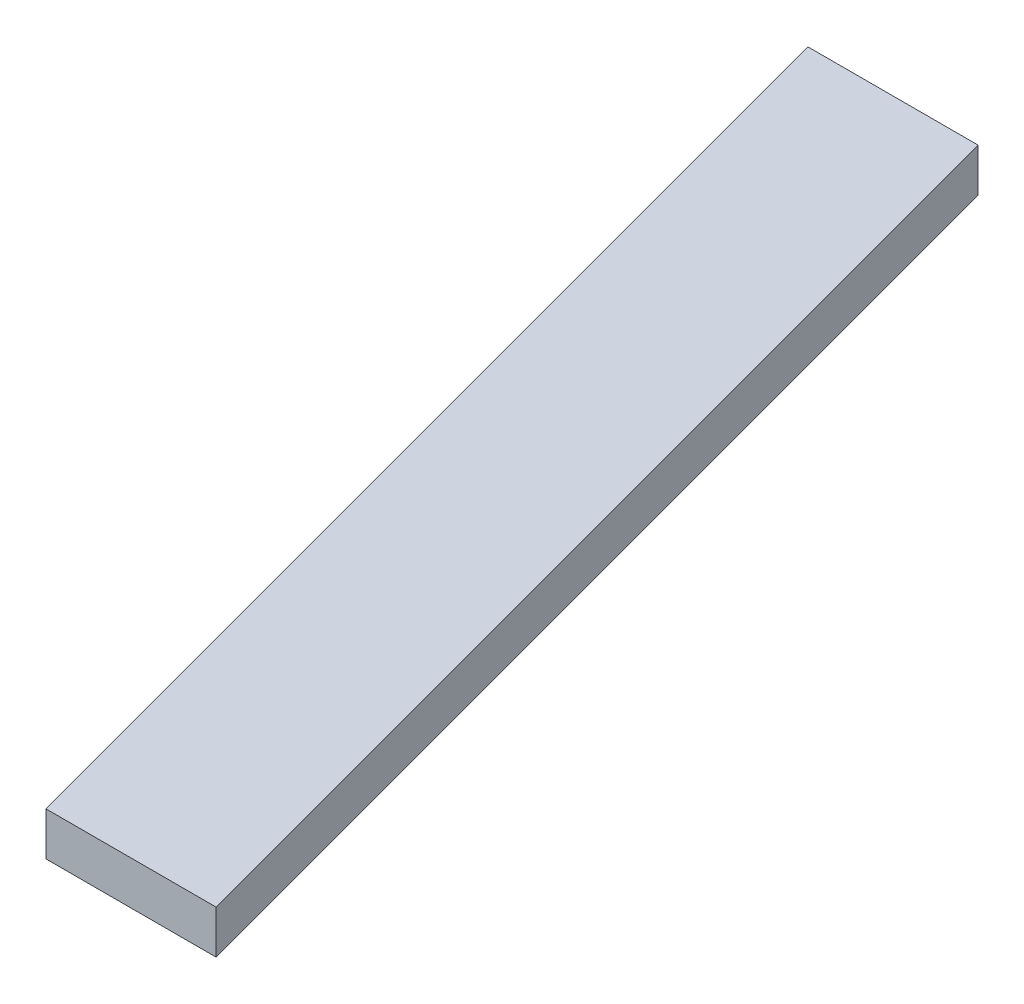
ISO-10303-21;
HEADER;
FILE_DESCRIPTION(('STEP AP214'),'2;1');
FILE_NAME('part.step','',(''),(''),'','','');
FILE_SCHEMA(('AUTOMOTIVE_DESIGN { 1 0 10303 214 1 1 1 1 }'));
ENDSEC;
DATA;
#1=APPLICATION_CONTEXT('core data for automotive mechanical design processes');
#2=APPLICATION_PROTOCOL_DEFINITION('international standard','automotive_design',2000,#1);
#3=PRODUCT_CONTEXT('',#1,'mechanical');
#4=PRODUCT('Part','Part','',(#3));
#5=PRODUCT_RELATED_PRODUCT_CATEGORY('part','',(#4));
#6=PRODUCT_DEFINITION_FORMATION('','',#4);
#7=PRODUCT_DEFINITION_CONTEXT('part definition',#1,'design');
#8=PRODUCT_DEFINITION('design','',#6,#7);
#9=PRODUCT_DEFINITION_SHAPE('','',#8);
#10=(LENGTH_UNIT() NAMED_UNIT(*) SI_UNIT(.MILLI.,.METRE.));
#11=(NAMED_UNIT(*) PLANE_ANGLE_UNIT() SI_UNIT($,.RADIAN.));
#12=(NAMED_UNIT(*) SI_UNIT($,.STERADIAN.) SOLID_ANGLE_UNIT());
#13=UNCERTAINTY_MEASURE_WITH_UNIT(LENGTH_MEASURE(1.E-05),#10,'distance_accuracy_value','');
#14=(GEOMETRIC_REPRESENTATION_CONTEXT(3) GLOBAL_UNCERTAINTY_ASSIGNED_CONTEXT((#13)) GLOBAL_UNIT_ASSIGNED_CONTEXT((#10,
#11,#12)) REPRESENTATION_CONTEXT('',''));
#15=CARTESIAN_POINT('',(0.,0.,0.));
#16=DIRECTION('',(0.,0.,1.));
#17=DIRECTION('',(1.,0.,0.));
#18=AXIS2_PLACEMENT_3D('',#15,#16,#17);
#19=CARTESIAN_POINT('',(20.4177284632519,3.175,76.2));
#20=DIRECTION('',(0.965925826289067,0.,-0.258819045102525));
#21=DIRECTION('',(-0.258819045102525,0.,-0.965925826289067));
#22=AXIS2_PLACEMENT_3D('',#19,#20,#21);
#23=PLANE('',#22);
#24=DIRECTION('',(0.258819045102525,0.,0.965925826289067));
#25=VECTOR('',#24,1.);
#26=CARTESIAN_POINT('',(20.4177284632519,0.,76.2));
#27=LINE('',#26,#25);
#28=CARTESIAN_POINT('',(0.,0.,0.));
#29=VERTEX_POINT('',#28);
#30=CARTESIAN_POINT('',(20.4177284632519,0.,76.2));
#31=VERTEX_POINT('',#30);
#32=EDGE_CURVE('E105',#29,#31,#27,.T.);
#33=ORIENTED_EDGE('',*,*,#32,.T.);
#34=DIRECTION('',(0.,-1.,0.));
#35=VECTOR('',#34,1.);
#36=CARTESIAN_POINT('',(20.4177284632519,3.175,76.2));
#37=LINE('',#36,#35);
#38=CARTESIAN_POINT('',(20.4177284632519,3.175,76.2));
#39=VERTEX_POINT('',#38);
#40=EDGE_CURVE('E11',#39,#31,#37,.T.);
#41=ORIENTED_EDGE('',*,*,#40,.F.);
#42=DIRECTION('',(0.258819045102525,0.,0.965925826289067));
#43=VECTOR('',#42,1.);
#44=CARTESIAN_POINT('',(20.4177284632519,3.175,76.2));
#45=LINE('',#44,#43);
#46=CARTESIAN_POINT('',(0.,3.175,0.));
#47=VERTEX_POINT('',#46);
#48=EDGE_CURVE('E89',#47,#39,#45,.T.);
#49=ORIENTED_EDGE('',*,*,#48,.F.);
#50=DIRECTION('',(0.,-1.,0.));
#51=VECTOR('',#50,1.);
#52=CARTESIAN_POINT('',(0.,3.175,0.));
#53=LINE('',#52,#51);
#54=EDGE_CURVE('E98',#47,#29,#53,.T.);
#55=ORIENTED_EDGE('',*,*,#54,.T.);
#56=EDGE_LOOP('',(#33,#41,#49,#55));
#57=FACE_BOUND('',#56,.T.);
#58=ADVANCED_FACE('F39',(#57),#23,.F.);
#59=CARTESIAN_POINT('',(32.8637284632513,3.175,76.2));
#60=DIRECTION('',(0.,0.,-1.));
#61=DIRECTION('',(-1.,0.,0.));
#62=AXIS2_PLACEMENT_3D('',#59,#60,#61);
#63=PLANE('',#62);
#64=DIRECTION('',(1.,0.,0.));
#65=VECTOR('',#64,1.);
#66=CARTESIAN_POINT('',(32.8637284632513,0.,76.2));
#67=LINE('',#66,#65);
#68=CARTESIAN_POINT('',(32.8637284632513,0.,76.2));
#69=VERTEX_POINT('',#68);
#70=EDGE_CURVE('E94',#31,#69,#67,.T.);
#71=ORIENTED_EDGE('',*,*,#70,.T.);
#72=DIRECTION('',(0.,-1.,0.));
#73=VECTOR('',#72,1.);
#74=CARTESIAN_POINT('',(32.8637284632513,3.175,76.2));
#75=LINE('',#74,#73);
#76=CARTESIAN_POINT('',(32.8637284632513,3.175,76.2));
#77=VERTEX_POINT('',#76);
#78=EDGE_CURVE('E50',#77,#69,#75,.T.);
#79=ORIENTED_EDGE('',*,*,#78,.F.);
#80=DIRECTION('',(1.,0.,0.));
#81=VECTOR('',#80,1.);
#82=CARTESIAN_POINT('',(32.8637284632513,3.175,76.2));
#83=LINE('',#82,#81);
#84=EDGE_CURVE('E84',#39,#77,#83,.T.);
#85=ORIENTED_EDGE('',*,*,#84,.F.);
#86=ORIENTED_EDGE('',*,*,#40,.T.);
#87=EDGE_LOOP('',(#71,#79,#85,#86));
#88=FACE_BOUND('',#87,.T.);
#89=ADVANCED_FACE('F91',(#88),#63,.F.);
#90=CARTESIAN_POINT('',(12.446,3.175,0.));
#91=DIRECTION('',(-0.965925826289069,0.,0.258819045102518));
#92=DIRECTION('',(0.258819045102518,0.,0.965925826289069));
#93=AXIS2_PLACEMENT_3D('',#90,#91,#92);
#94=PLANE('',#93);
#95=DIRECTION('',(-0.258819045102518,0.,-0.965925826289069));
#96=VECTOR('',#95,1.);
#97=CARTESIAN_POINT('',(12.446,0.,0.));
#98=LINE('',#97,#96);
#99=CARTESIAN_POINT('',(12.446,0.,0.));
#100=VERTEX_POINT('',#99);
#101=EDGE_CURVE('E75',#69,#100,#98,.T.);
#102=ORIENTED_EDGE('',*,*,#101,.T.);
#103=DIRECTION('',(0.,-1.,0.));
#104=VECTOR('',#103,1.);
#105=CARTESIAN_POINT('',(12.446,3.175,0.));
#106=LINE('',#105,#104);
#107=CARTESIAN_POINT('',(12.446,3.175,0.));
#108=VERTEX_POINT('',#107);
#109=EDGE_CURVE('E92',#108,#100,#106,.T.);
#110=ORIENTED_EDGE('',*,*,#109,.F.);
#111=DIRECTION('',(-0.258819045102518,0.,-0.965925826289069));
#112=VECTOR('',#111,1.);
#113=CARTESIAN_POINT('',(12.446,3.175,0.));
#114=LINE('',#113,#112);
#115=EDGE_CURVE('E86',#77,#108,#114,.T.);
#116=ORIENTED_EDGE('',*,*,#115,.F.);
#117=ORIENTED_EDGE('',*,*,#78,.T.);
#118=EDGE_LOOP('',(#102,#110,#116,#117));
#119=FACE_BOUND('',#118,.T.);
#120=ADVANCED_FACE('F96',(#119),#94,.F.);
#121=CARTESIAN_POINT('',(0.,3.175,0.));
#122=DIRECTION('',(0.,0.,1.));
#123=DIRECTION('',(1.,0.,0.));
#124=AXIS2_PLACEMENT_3D('',#121,#122,#123);
#125=PLANE('',#124);
#126=DIRECTION('',(-1.,0.,0.));
#127=VECTOR('',#126,1.);
#128=CARTESIAN_POINT('',(0.,0.,0.));
#129=LINE('',#128,#127);
#130=EDGE_CURVE('E79',#100,#29,#129,.T.);
#131=ORIENTED_EDGE('',*,*,#130,.T.);
#132=ORIENTED_EDGE('',*,*,#54,.F.);
#133=DIRECTION('',(-1.,0.,0.));
#134=VECTOR('',#133,1.);
#135=CARTESIAN_POINT('',(0.,3.175,0.));
#136=LINE('',#135,#134);
#137=EDGE_CURVE('E54',#108,#47,#136,.T.);
#138=ORIENTED_EDGE('',*,*,#137,.F.);
#139=ORIENTED_EDGE('',*,*,#109,.T.);
#140=EDGE_LOOP('',(#131,#132,#138,#139));
#141=FACE_BOUND('',#140,.T.);
#142=ADVANCED_FACE('F108',(#141),#125,.F.);
#143=CARTESIAN_POINT('',(0.,3.175,0.));
#144=DIRECTION('',(0.,-1.,0.));
#145=DIRECTION('',(0.,0.,-1.));
#146=AXIS2_PLACEMENT_3D('',#143,#144,#145);
#147=PLANE('',#146);
#148=ORIENTED_EDGE('',*,*,#48,.T.);
#149=ORIENTED_EDGE('',*,*,#84,.T.);
#150=ORIENTED_EDGE('',*,*,#115,.T.);
#151=ORIENTED_EDGE('',*,*,#137,.T.);
#152=EDGE_LOOP('',(#148,#149,#150,#151));
#153=FACE_BOUND('',#152,.T.);
#154=ADVANCED_FACE('F88',(#153),#147,.F.);
#155=CARTESIAN_POINT('',(0.,0.,0.));
#156=DIRECTION('',(0.,-1.,0.));
#157=DIRECTION('',(0.,0.,-1.));
#158=AXIS2_PLACEMENT_3D('',#155,#156,#157);
#159=PLANE('',#158);
#160=ORIENTED_EDGE('',*,*,#32,.F.);
#161=ORIENTED_EDGE('',*,*,#130,.F.);
#162=ORIENTED_EDGE('',*,*,#101,.F.);
#163=ORIENTED_EDGE('',*,*,#70,.F.);
#164=EDGE_LOOP('',(#160,#161,#162,#163));
#165=FACE_BOUND('',#164,.T.);
#166=ADVANCED_FACE('F115',(#165),#159,.T.);
#167=CLOSED_SHELL('',(#58,#89,#120,#142,#154,#166));
#168=MANIFOLD_SOLID_BREP('B2',#167);
#169=ADVANCED_BREP_SHAPE_REPRESENTATION('',(#18,#168),#14);
#170=SHAPE_DEFINITION_REPRESENTATION(#9,#169);
ENDSEC;
END-ISO-10303-21;
